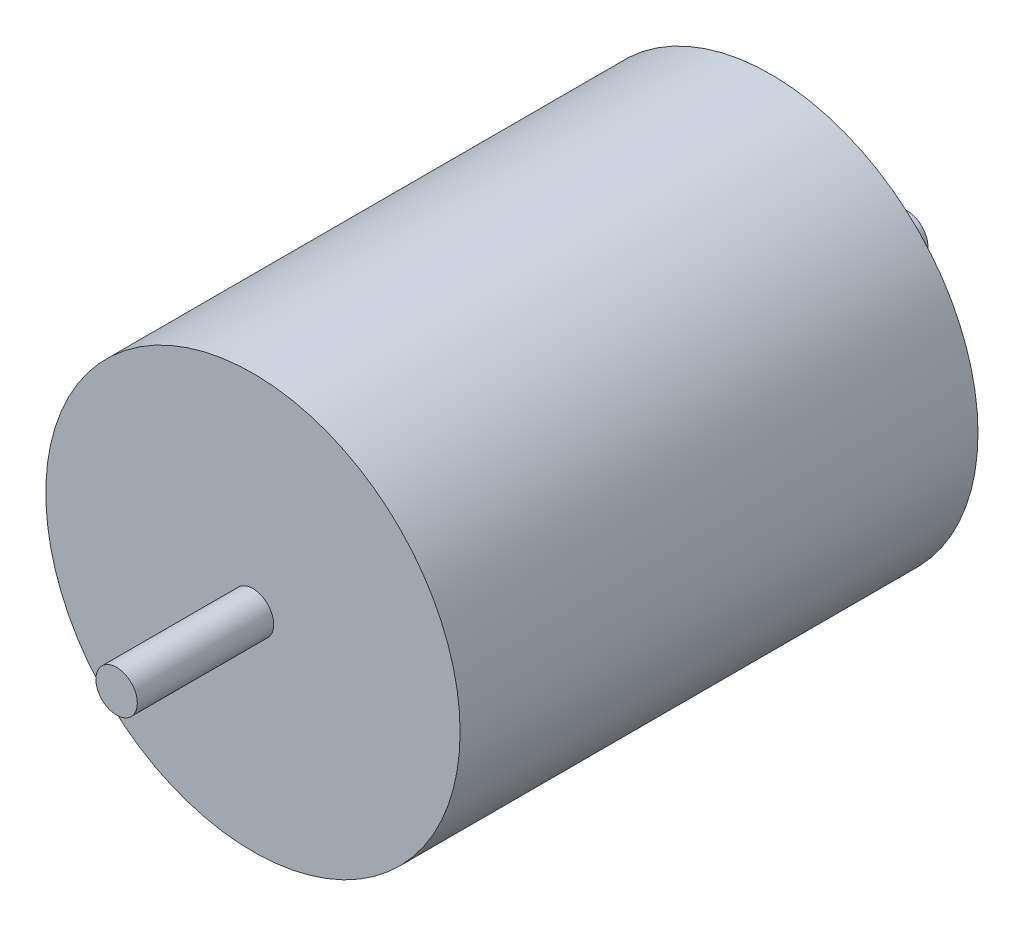
ISO-10303-21;
HEADER;
FILE_DESCRIPTION(('STEP AP214'),'2;1');
FILE_NAME('part.step','',(''),(''),'','','');
FILE_SCHEMA(('AUTOMOTIVE_DESIGN { 1 0 10303 214 1 1 1 1 }'));
ENDSEC;
DATA;
#1=APPLICATION_CONTEXT('core data for automotive mechanical design processes');
#2=APPLICATION_PROTOCOL_DEFINITION('international standard','automotive_design',2000,#1);
#3=PRODUCT_CONTEXT('',#1,'mechanical');
#4=PRODUCT('Part','Part','',(#3));
#5=PRODUCT_RELATED_PRODUCT_CATEGORY('part','',(#4));
#6=PRODUCT_DEFINITION_FORMATION('','',#4);
#7=PRODUCT_DEFINITION_CONTEXT('part definition',#1,'design');
#8=PRODUCT_DEFINITION('design','',#6,#7);
#9=PRODUCT_DEFINITION_SHAPE('','',#8);
#10=(LENGTH_UNIT() NAMED_UNIT(*) SI_UNIT(.MILLI.,.METRE.));
#11=(NAMED_UNIT(*) PLANE_ANGLE_UNIT() SI_UNIT($,.RADIAN.));
#12=(NAMED_UNIT(*) SI_UNIT($,.STERADIAN.) SOLID_ANGLE_UNIT());
#13=UNCERTAINTY_MEASURE_WITH_UNIT(LENGTH_MEASURE(1.E-05),#10,'distance_accuracy_value','');
#14=(GEOMETRIC_REPRESENTATION_CONTEXT(3) GLOBAL_UNCERTAINTY_ASSIGNED_CONTEXT((#13)) GLOBAL_UNIT_ASSIGNED_CONTEXT((#10,
#11,#12)) REPRESENTATION_CONTEXT('',''));
#15=CARTESIAN_POINT('',(0.,0.,0.));
#16=DIRECTION('',(0.,0.,1.));
#17=DIRECTION('',(1.,0.,0.));
#18=AXIS2_PLACEMENT_3D('',#15,#16,#17);
#19=CARTESIAN_POINT('',(0.,0.,7.5));
#20=DIRECTION('',(0.,0.,1.));
#21=DIRECTION('',(1.,0.,0.));
#22=AXIS2_PLACEMENT_3D('',#19,#20,#21);
#23=PLANE('',#22);
#24=CARTESIAN_POINT('',(0.,0.,7.5));
#25=DIRECTION('',(0.,0.,1.));
#26=DIRECTION('',(1.,0.,0.));
#27=AXIS2_PLACEMENT_3D('',#24,#25,#26);
#28=CIRCLE('',#27,6.);
#29=CARTESIAN_POINT('',(6.,0.,7.5));
#30=VERTEX_POINT('',#29);
#31=EDGE_CURVE('E10',#30,#30,#28,.T.);
#32=ORIENTED_EDGE('',*,*,#31,.T.);
#33=EDGE_LOOP('',(#32));
#34=FACE_BOUND('',#33,.T.);
#35=CARTESIAN_POINT('',(0.,0.,7.5));
#36=DIRECTION('',(0.,0.,1.));
#37=DIRECTION('',(1.,0.,0.));
#38=AXIS2_PLACEMENT_3D('',#35,#36,#37);
#39=CIRCLE('',#38,0.6);
#40=CARTESIAN_POINT('',(0.6,0.,7.5));
#41=VERTEX_POINT('',#40);
#42=EDGE_CURVE('E54',#41,#41,#39,.T.);
#43=ORIENTED_EDGE('',*,*,#42,.F.);
#44=EDGE_LOOP('',(#43));
#45=FACE_BOUND('',#44,.T.);
#46=ADVANCED_FACE('F41',(#34,#45),#23,.T.);
#47=CARTESIAN_POINT('',(0.,0.,-7.5));
#48=DIRECTION('',(0.,0.,1.));
#49=DIRECTION('',(1.,0.,0.));
#50=AXIS2_PLACEMENT_3D('',#47,#48,#49);
#51=PLANE('',#50);
#52=CARTESIAN_POINT('',(0.,0.,-7.5));
#53=DIRECTION('',(0.,0.,1.));
#54=DIRECTION('',(1.,0.,0.));
#55=AXIS2_PLACEMENT_3D('',#52,#53,#54);
#56=CIRCLE('',#55,6.);
#57=CARTESIAN_POINT('',(6.,0.,-7.5));
#58=VERTEX_POINT('',#57);
#59=EDGE_CURVE('E45',#58,#58,#56,.T.);
#60=ORIENTED_EDGE('',*,*,#59,.F.);
#61=EDGE_LOOP('',(#60));
#62=FACE_BOUND('',#61,.T.);
#63=CARTESIAN_POINT('',(0.,0.,-7.5));
#64=DIRECTION('',(0.,0.,1.));
#65=DIRECTION('',(1.,0.,0.));
#66=AXIS2_PLACEMENT_3D('',#63,#64,#65);
#67=CIRCLE('',#66,0.6);
#68=CARTESIAN_POINT('',(0.6,0.,-7.5));
#69=VERTEX_POINT('',#68);
#70=EDGE_CURVE('E59',#69,#69,#67,.F.);
#71=ORIENTED_EDGE('',*,*,#70,.F.);
#72=EDGE_LOOP('',(#71));
#73=FACE_BOUND('',#72,.T.);
#74=ADVANCED_FACE('F89',(#62,#73),#51,.F.);
#75=CARTESIAN_POINT('',(0.,0.,7.5));
#76=DIRECTION('',(0.,0.,-1.));
#77=DIRECTION('',(-1.,0.,0.));
#78=AXIS2_PLACEMENT_3D('',#75,#76,#77);
#79=CYLINDRICAL_SURFACE('',#78,6.);
#80=ORIENTED_EDGE('',*,*,#31,.F.);
#81=EDGE_LOOP('',(#80));
#82=FACE_BOUND('',#81,.T.);
#83=ORIENTED_EDGE('',*,*,#59,.T.);
#84=EDGE_LOOP('',(#83));
#85=FACE_BOUND('',#84,.T.);
#86=ADVANCED_FACE('F43',(#82,#85),#79,.T.);
#87=CARTESIAN_POINT('',(0.,0.,-11.45));
#88=DIRECTION('',(0.,0.,1.));
#89=DIRECTION('',(1.,0.,0.));
#90=AXIS2_PLACEMENT_3D('',#87,#88,#89);
#91=PLANE('',#90);
#92=CARTESIAN_POINT('',(0.,0.,-11.45));
#93=DIRECTION('',(0.,0.,1.));
#94=DIRECTION('',(1.,0.,0.));
#95=AXIS2_PLACEMENT_3D('',#92,#93,#94);
#96=CIRCLE('',#95,0.6);
#97=CARTESIAN_POINT('',(0.6,0.,-11.45));
#98=VERTEX_POINT('',#97);
#99=EDGE_CURVE('E64',#98,#98,#96,.T.);
#100=ORIENTED_EDGE('',*,*,#99,.F.);
#101=EDGE_LOOP('',(#100));
#102=FACE_BOUND('',#101,.T.);
#103=ADVANCED_FACE('F84',(#102),#91,.F.);
#104=CARTESIAN_POINT('',(0.,0.,11.45));
#105=DIRECTION('',(0.,0.,-1.));
#106=DIRECTION('',(-1.,0.,0.));
#107=AXIS2_PLACEMENT_3D('',#104,#105,#106);
#108=CYLINDRICAL_SURFACE('',#107,0.6);
#109=ORIENTED_EDGE('',*,*,#99,.T.);
#110=EDGE_LOOP('',(#109));
#111=FACE_BOUND('',#110,.T.);
#112=ORIENTED_EDGE('',*,*,#70,.T.);
#113=EDGE_LOOP('',(#112));
#114=FACE_BOUND('',#113,.T.);
#115=ADVANCED_FACE('F76',(#111,#114),#108,.T.);
#116=ORIENTED_EDGE('',*,*,#42,.T.);
#117=EDGE_LOOP('',(#116));
#118=FACE_BOUND('',#117,.T.);
#119=CARTESIAN_POINT('',(0.,0.,11.45));
#120=DIRECTION('',(0.,0.,1.));
#121=DIRECTION('',(1.,0.,0.));
#122=AXIS2_PLACEMENT_3D('',#119,#120,#121);
#123=CIRCLE('',#122,0.6);
#124=CARTESIAN_POINT('',(0.6,0.,11.45));
#125=VERTEX_POINT('',#124);
#126=EDGE_CURVE('E63',#125,#125,#123,.T.);
#127=ORIENTED_EDGE('',*,*,#126,.F.);
#128=EDGE_LOOP('',(#127));
#129=FACE_BOUND('',#128,.T.);
#130=ADVANCED_FACE('F74',(#118,#129),#108,.T.);
#131=CARTESIAN_POINT('',(0.,0.,11.45));
#132=DIRECTION('',(0.,0.,1.));
#133=DIRECTION('',(1.,0.,0.));
#134=AXIS2_PLACEMENT_3D('',#131,#132,#133);
#135=PLANE('',#134);
#136=ORIENTED_EDGE('',*,*,#126,.T.);
#137=EDGE_LOOP('',(#136));
#138=FACE_BOUND('',#137,.T.);
#139=ADVANCED_FACE('F72',(#138),#135,.T.);
#140=CLOSED_SHELL('',(#46,#74,#86,#103,#115,#130,#139));
#141=MANIFOLD_SOLID_BREP('B2',#140);
#142=ADVANCED_BREP_SHAPE_REPRESENTATION('',(#18,#141),#14);
#143=SHAPE_DEFINITION_REPRESENTATION(#9,#142);
ENDSEC;
END-ISO-10303-21;
